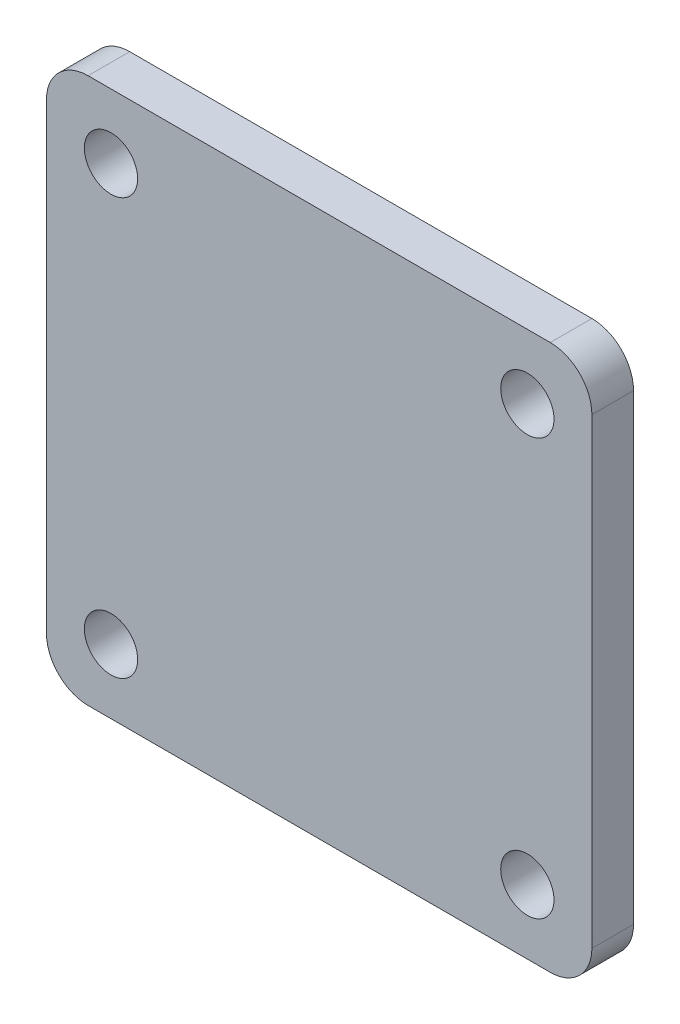
ISO-10303-21;
HEADER;
FILE_DESCRIPTION(('STEP AP214'),'2;1');
FILE_NAME('part.step','',(''),(''),'','','');
FILE_SCHEMA(('AUTOMOTIVE_DESIGN { 1 0 10303 214 1 1 1 1 }'));
ENDSEC;
DATA;
#1=APPLICATION_CONTEXT('core data for automotive mechanical design processes');
#2=APPLICATION_PROTOCOL_DEFINITION('international standard','automotive_design',2000,#1);
#3=PRODUCT_CONTEXT('',#1,'mechanical');
#4=PRODUCT('Part','Part','',(#3));
#5=PRODUCT_RELATED_PRODUCT_CATEGORY('part','',(#4));
#6=PRODUCT_DEFINITION_FORMATION('','',#4);
#7=PRODUCT_DEFINITION_CONTEXT('part definition',#1,'design');
#8=PRODUCT_DEFINITION('design','',#6,#7);
#9=PRODUCT_DEFINITION_SHAPE('','',#8);
#10=(LENGTH_UNIT() NAMED_UNIT(*) SI_UNIT(.MILLI.,.METRE.));
#11=(NAMED_UNIT(*) PLANE_ANGLE_UNIT() SI_UNIT($,.RADIAN.));
#12=(NAMED_UNIT(*) SI_UNIT($,.STERADIAN.) SOLID_ANGLE_UNIT());
#13=UNCERTAINTY_MEASURE_WITH_UNIT(LENGTH_MEASURE(1.E-05),#10,'distance_accuracy_value','');
#14=(GEOMETRIC_REPRESENTATION_CONTEXT(3) GLOBAL_UNCERTAINTY_ASSIGNED_CONTEXT((#13)) GLOBAL_UNIT_ASSIGNED_CONTEXT((#10,
#11,#12)) REPRESENTATION_CONTEXT('',''));
#15=CARTESIAN_POINT('',(0.,0.,0.));
#16=DIRECTION('',(0.,0.,1.));
#17=DIRECTION('',(1.,0.,0.));
#18=AXIS2_PLACEMENT_3D('',#15,#16,#17);
#19=CARTESIAN_POINT('',(-32.75,-32.75,5.));
#20=DIRECTION('',(-1.,0.,0.));
#21=DIRECTION('',(0.,0.,1.));
#22=AXIS2_PLACEMENT_3D('',#19,#20,#21);
#23=PLANE('',#22);
#24=DIRECTION('',(0.,1.,0.));
#25=VECTOR('',#24,1.);
#26=CARTESIAN_POINT('',(-32.75,-32.75,0.));
#27=LINE('',#26,#25);
#28=CARTESIAN_POINT('',(-32.75,-27.75,0.));
#29=VERTEX_POINT('',#28);
#30=CARTESIAN_POINT('',(-32.75,27.75,0.));
#31=VERTEX_POINT('',#30);
#32=EDGE_CURVE('E184',#29,#31,#27,.T.);
#33=ORIENTED_EDGE('',*,*,#32,.F.);
#34=DIRECTION('',(0.,0.,-1.));
#35=VECTOR('',#34,1.);
#36=CARTESIAN_POINT('',(-32.75,-27.75,5.));
#37=LINE('',#36,#35);
#38=CARTESIAN_POINT('',(-32.75,-27.75,5.));
#39=VERTEX_POINT('',#38);
#40=EDGE_CURVE('E108',#29,#39,#37,.F.);
#41=ORIENTED_EDGE('',*,*,#40,.T.);
#42=DIRECTION('',(0.,1.,0.));
#43=VECTOR('',#42,1.);
#44=CARTESIAN_POINT('',(-32.75,-32.75,5.));
#45=LINE('',#44,#43);
#46=CARTESIAN_POINT('',(-32.75,27.75,5.));
#47=VERTEX_POINT('',#46);
#48=EDGE_CURVE('E129',#39,#47,#45,.T.);
#49=ORIENTED_EDGE('',*,*,#48,.T.);
#50=DIRECTION('',(0.,0.,-1.));
#51=VECTOR('',#50,1.);
#52=CARTESIAN_POINT('',(-32.75,27.75,5.));
#53=LINE('',#52,#51);
#54=EDGE_CURVE('E113',#47,#31,#53,.T.);
#55=ORIENTED_EDGE('',*,*,#54,.T.);
#56=EDGE_LOOP('',(#33,#41,#49,#55));
#57=FACE_BOUND('',#56,.T.);
#58=ADVANCED_FACE('F35',(#57),#23,.T.);
#59=CARTESIAN_POINT('',(-32.75,-32.75,5.));
#60=DIRECTION('',(0.,1.,0.));
#61=DIRECTION('',(0.,0.,1.));
#62=AXIS2_PLACEMENT_3D('',#59,#60,#61);
#63=PLANE('',#62);
#64=DIRECTION('',(1.,0.,0.));
#65=VECTOR('',#64,1.);
#66=CARTESIAN_POINT('',(-32.75,-32.75,5.));
#67=LINE('',#66,#65);
#68=CARTESIAN_POINT('',(-27.75,-32.75,5.));
#69=VERTEX_POINT('',#68);
#70=CARTESIAN_POINT('',(27.75,-32.75,5.));
#71=VERTEX_POINT('',#70);
#72=EDGE_CURVE('E123',#69,#71,#67,.T.);
#73=ORIENTED_EDGE('',*,*,#72,.F.);
#74=DIRECTION('',(0.,0.,-1.));
#75=VECTOR('',#74,1.);
#76=CARTESIAN_POINT('',(-27.75,-32.75,0.));
#77=LINE('',#76,#75);
#78=CARTESIAN_POINT('',(-27.75,-32.75,0.));
#79=VERTEX_POINT('',#78);
#80=EDGE_CURVE('E107',#69,#79,#77,.T.);
#81=ORIENTED_EDGE('',*,*,#80,.T.);
#82=DIRECTION('',(1.,0.,0.));
#83=VECTOR('',#82,1.);
#84=CARTESIAN_POINT('',(-32.75,-32.75,0.));
#85=LINE('',#84,#83);
#86=CARTESIAN_POINT('',(27.75,-32.75,0.));
#87=VERTEX_POINT('',#86);
#88=EDGE_CURVE('E120',#79,#87,#85,.T.);
#89=ORIENTED_EDGE('',*,*,#88,.T.);
#90=DIRECTION('',(0.,0.,-1.));
#91=VECTOR('',#90,1.);
#92=CARTESIAN_POINT('',(27.75,-32.75,5.));
#93=LINE('',#92,#91);
#94=EDGE_CURVE('E125',#87,#71,#93,.F.);
#95=ORIENTED_EDGE('',*,*,#94,.T.);
#96=EDGE_LOOP('',(#73,#81,#89,#95));
#97=FACE_BOUND('',#96,.T.);
#98=ADVANCED_FACE('F119',(#97),#63,.F.);
#99=CARTESIAN_POINT('',(32.75,-32.75,5.));
#100=DIRECTION('',(-1.,0.,0.));
#101=DIRECTION('',(0.,0.,1.));
#102=AXIS2_PLACEMENT_3D('',#99,#100,#101);
#103=PLANE('',#102);
#104=DIRECTION('',(0.,1.,0.));
#105=VECTOR('',#104,1.);
#106=CARTESIAN_POINT('',(32.75,-32.75,5.));
#107=LINE('',#106,#105);
#108=CARTESIAN_POINT('',(32.75,-27.75,5.));
#109=VERTEX_POINT('',#108);
#110=CARTESIAN_POINT('',(32.75,27.75,5.));
#111=VERTEX_POINT('',#110);
#112=EDGE_CURVE('E188',#109,#111,#107,.T.);
#113=ORIENTED_EDGE('',*,*,#112,.F.);
#114=DIRECTION('',(0.,0.,-1.));
#115=VECTOR('',#114,1.);
#116=CARTESIAN_POINT('',(32.75,-27.75,5.));
#117=LINE('',#116,#115);
#118=CARTESIAN_POINT('',(32.75,-27.75,0.));
#119=VERTEX_POINT('',#118);
#120=EDGE_CURVE('E157',#109,#119,#117,.T.);
#121=ORIENTED_EDGE('',*,*,#120,.T.);
#122=DIRECTION('',(0.,1.,0.));
#123=VECTOR('',#122,1.);
#124=CARTESIAN_POINT('',(32.75,-32.75,0.));
#125=LINE('',#124,#123);
#126=CARTESIAN_POINT('',(32.75,27.75,0.));
#127=VERTEX_POINT('',#126);
#128=EDGE_CURVE('E130',#119,#127,#125,.T.);
#129=ORIENTED_EDGE('',*,*,#128,.T.);
#130=DIRECTION('',(0.,0.,-1.));
#131=VECTOR('',#130,1.);
#132=CARTESIAN_POINT('',(32.75,27.75,5.));
#133=LINE('',#132,#131);
#134=EDGE_CURVE('E155',#127,#111,#133,.F.);
#135=ORIENTED_EDGE('',*,*,#134,.T.);
#136=EDGE_LOOP('',(#113,#121,#129,#135));
#137=FACE_BOUND('',#136,.T.);
#138=ADVANCED_FACE('F205',(#137),#103,.F.);
#139=CARTESIAN_POINT('',(-32.75,32.75,5.));
#140=DIRECTION('',(0.,1.,0.));
#141=DIRECTION('',(0.,0.,1.));
#142=AXIS2_PLACEMENT_3D('',#139,#140,#141);
#143=PLANE('',#142);
#144=DIRECTION('',(1.,0.,0.));
#145=VECTOR('',#144,1.);
#146=CARTESIAN_POINT('',(-32.75,32.75,5.));
#147=LINE('',#146,#145);
#148=CARTESIAN_POINT('',(-27.75,32.75,5.));
#149=VERTEX_POINT('',#148);
#150=CARTESIAN_POINT('',(27.75,32.75,5.));
#151=VERTEX_POINT('',#150);
#152=EDGE_CURVE('E133',#149,#151,#147,.T.);
#153=ORIENTED_EDGE('',*,*,#152,.T.);
#154=DIRECTION('',(0.,0.,-1.));
#155=VECTOR('',#154,1.);
#156=CARTESIAN_POINT('',(27.75,32.75,0.));
#157=LINE('',#156,#155);
#158=CARTESIAN_POINT('',(27.75,32.75,0.));
#159=VERTEX_POINT('',#158);
#160=EDGE_CURVE('E11',#151,#159,#157,.T.);
#161=ORIENTED_EDGE('',*,*,#160,.T.);
#162=DIRECTION('',(1.,0.,0.));
#163=VECTOR('',#162,1.);
#164=CARTESIAN_POINT('',(-32.75,32.75,0.));
#165=LINE('',#164,#163);
#166=CARTESIAN_POINT('',(-27.75,32.75,0.));
#167=VERTEX_POINT('',#166);
#168=EDGE_CURVE('E136',#167,#159,#165,.T.);
#169=ORIENTED_EDGE('',*,*,#168,.F.);
#170=DIRECTION('',(0.,0.,-1.));
#171=VECTOR('',#170,1.);
#172=CARTESIAN_POINT('',(-27.75,32.75,5.));
#173=LINE('',#172,#171);
#174=EDGE_CURVE('E44',#167,#149,#173,.F.);
#175=ORIENTED_EDGE('',*,*,#174,.T.);
#176=EDGE_LOOP('',(#153,#161,#169,#175));
#177=FACE_BOUND('',#176,.T.);
#178=ADVANCED_FACE('F192',(#177),#143,.T.);
#179=CARTESIAN_POINT('',(0.,0.,5.));
#180=DIRECTION('',(0.,0.,-1.));
#181=DIRECTION('',(-1.,0.,0.));
#182=AXIS2_PLACEMENT_3D('',#179,#180,#181);
#183=PLANE('',#182);
#184=CARTESIAN_POINT('',(-25.,-25.0000000000004,5.));
#185=DIRECTION('',(0.,0.,1.));
#186=DIRECTION('',(1.,0.,0.));
#187=AXIS2_PLACEMENT_3D('',#184,#185,#186);
#188=CIRCLE('',#187,3.2);
#189=CARTESIAN_POINT('',(-21.8,-25.0000000000004,5.));
#190=VERTEX_POINT('',#189);
#191=EDGE_CURVE('E162',#190,#190,#188,.T.);
#192=ORIENTED_EDGE('',*,*,#191,.F.);
#193=EDGE_LOOP('',(#192));
#194=FACE_BOUND('',#193,.T.);
#195=CARTESIAN_POINT('',(-25.,24.9999999999997,5.));
#196=DIRECTION('',(0.,0.,1.));
#197=DIRECTION('',(1.,0.,0.));
#198=AXIS2_PLACEMENT_3D('',#195,#196,#197);
#199=CIRCLE('',#198,3.2);
#200=CARTESIAN_POINT('',(-21.8,24.9999999999997,5.));
#201=VERTEX_POINT('',#200);
#202=EDGE_CURVE('E168',#201,#201,#199,.T.);
#203=ORIENTED_EDGE('',*,*,#202,.F.);
#204=EDGE_LOOP('',(#203));
#205=FACE_BOUND('',#204,.T.);
#206=CARTESIAN_POINT('',(25.,25.,5.));
#207=DIRECTION('',(0.,0.,-1.));
#208=DIRECTION('',(-1.,0.,0.));
#209=AXIS2_PLACEMENT_3D('',#206,#207,#208);
#210=CIRCLE('',#209,3.2);
#211=CARTESIAN_POINT('',(21.8,25.,5.));
#212=VERTEX_POINT('',#211);
#213=EDGE_CURVE('E175',#212,#212,#210,.T.);
#214=ORIENTED_EDGE('',*,*,#213,.T.);
#215=EDGE_LOOP('',(#214));
#216=FACE_BOUND('',#215,.T.);
#217=CARTESIAN_POINT('',(25.,-25.,5.));
#218=DIRECTION('',(0.,0.,-1.));
#219=DIRECTION('',(-1.,0.,0.));
#220=AXIS2_PLACEMENT_3D('',#217,#218,#219);
#221=CIRCLE('',#220,3.2);
#222=CARTESIAN_POINT('',(21.8,-25.,5.));
#223=VERTEX_POINT('',#222);
#224=EDGE_CURVE('E181',#223,#223,#221,.T.);
#225=ORIENTED_EDGE('',*,*,#224,.T.);
#226=EDGE_LOOP('',(#225));
#227=FACE_BOUND('',#226,.T.);
#228=ORIENTED_EDGE('',*,*,#48,.F.);
#229=CARTESIAN_POINT('',(-27.75,-27.75,5.));
#230=DIRECTION('',(0.,0.,-1.));
#231=DIRECTION('',(-1.,0.,0.));
#232=AXIS2_PLACEMENT_3D('',#229,#230,#231);
#233=CIRCLE('',#232,5.);
#234=EDGE_CURVE('E153',#39,#69,#233,.F.);
#235=ORIENTED_EDGE('',*,*,#234,.T.);
#236=ORIENTED_EDGE('',*,*,#72,.T.);
#237=CARTESIAN_POINT('',(27.75,-27.75,5.));
#238=DIRECTION('',(0.,0.,-1.));
#239=DIRECTION('',(-1.,0.,0.));
#240=AXIS2_PLACEMENT_3D('',#237,#238,#239);
#241=CIRCLE('',#240,5.);
#242=EDGE_CURVE('E151',#71,#109,#241,.F.);
#243=ORIENTED_EDGE('',*,*,#242,.T.);
#244=ORIENTED_EDGE('',*,*,#112,.T.);
#245=CARTESIAN_POINT('',(27.75,27.75,5.));
#246=DIRECTION('',(0.,0.,-1.));
#247=DIRECTION('',(-1.,0.,0.));
#248=AXIS2_PLACEMENT_3D('',#245,#246,#247);
#249=CIRCLE('',#248,5.);
#250=EDGE_CURVE('E52',#111,#151,#249,.F.);
#251=ORIENTED_EDGE('',*,*,#250,.T.);
#252=ORIENTED_EDGE('',*,*,#152,.F.);
#253=CARTESIAN_POINT('',(-27.75,27.75,5.));
#254=DIRECTION('',(0.,0.,-1.));
#255=DIRECTION('',(-1.,0.,0.));
#256=AXIS2_PLACEMENT_3D('',#253,#254,#255);
#257=CIRCLE('',#256,5.);
#258=EDGE_CURVE('E148',#149,#47,#257,.F.);
#259=ORIENTED_EDGE('',*,*,#258,.T.);
#260=EDGE_LOOP('',(#228,#235,#236,#243,#244,#251,#252,#259));
#261=FACE_BOUND('',#260,.T.);
#262=ADVANCED_FACE('F198',(#194,#205,#216,#227,#261),#183,.F.);
#263=CARTESIAN_POINT('',(0.,0.,0.));
#264=DIRECTION('',(0.,0.,-1.));
#265=DIRECTION('',(-1.,0.,0.));
#266=AXIS2_PLACEMENT_3D('',#263,#264,#265);
#267=PLANE('',#266);
#268=CARTESIAN_POINT('',(-25.,-25.0000000000004,0.));
#269=DIRECTION('',(0.,0.,-1.));
#270=DIRECTION('',(-1.,0.,0.));
#271=AXIS2_PLACEMENT_3D('',#268,#269,#270);
#272=CIRCLE('',#271,3.2);
#273=CARTESIAN_POINT('',(-28.2,-25.0000000000004,0.));
#274=VERTEX_POINT('',#273);
#275=EDGE_CURVE('E39',#274,#274,#272,.T.);
#276=ORIENTED_EDGE('',*,*,#275,.F.);
#277=EDGE_LOOP('',(#276));
#278=FACE_BOUND('',#277,.T.);
#279=CARTESIAN_POINT('',(-25.,24.9999999999997,0.));
#280=DIRECTION('',(0.,0.,-1.));
#281=DIRECTION('',(-1.,0.,0.));
#282=AXIS2_PLACEMENT_3D('',#279,#280,#281);
#283=CIRCLE('',#282,3.2);
#284=CARTESIAN_POINT('',(-28.2,24.9999999999997,0.));
#285=VERTEX_POINT('',#284);
#286=EDGE_CURVE('E160',#285,#285,#283,.T.);
#287=ORIENTED_EDGE('',*,*,#286,.F.);
#288=EDGE_LOOP('',(#287));
#289=FACE_BOUND('',#288,.T.);
#290=CARTESIAN_POINT('',(25.,25.,0.));
#291=DIRECTION('',(0.,0.,-1.));
#292=DIRECTION('',(-1.,0.,0.));
#293=AXIS2_PLACEMENT_3D('',#290,#291,#292);
#294=CIRCLE('',#293,3.2);
#295=CARTESIAN_POINT('',(21.8,25.,0.));
#296=VERTEX_POINT('',#295);
#297=EDGE_CURVE('E166',#296,#296,#294,.T.);
#298=ORIENTED_EDGE('',*,*,#297,.F.);
#299=EDGE_LOOP('',(#298));
#300=FACE_BOUND('',#299,.T.);
#301=CARTESIAN_POINT('',(25.,-25.,0.));
#302=DIRECTION('',(0.,0.,-1.));
#303=DIRECTION('',(-1.,0.,0.));
#304=AXIS2_PLACEMENT_3D('',#301,#302,#303);
#305=CIRCLE('',#304,3.2);
#306=CARTESIAN_POINT('',(21.8,-25.,0.));
#307=VERTEX_POINT('',#306);
#308=EDGE_CURVE('E178',#307,#307,#305,.T.);
#309=ORIENTED_EDGE('',*,*,#308,.F.);
#310=EDGE_LOOP('',(#309));
#311=FACE_BOUND('',#310,.T.);
#312=ORIENTED_EDGE('',*,*,#88,.F.);
#313=CARTESIAN_POINT('',(-27.75,-27.75,0.));
#314=DIRECTION('',(0.,0.,-1.));
#315=DIRECTION('',(-1.,0.,0.));
#316=AXIS2_PLACEMENT_3D('',#313,#314,#315);
#317=CIRCLE('',#316,5.);
#318=EDGE_CURVE('E103',#79,#29,#317,.T.);
#319=ORIENTED_EDGE('',*,*,#318,.T.);
#320=ORIENTED_EDGE('',*,*,#32,.T.);
#321=CARTESIAN_POINT('',(-27.75,27.75,0.));
#322=DIRECTION('',(0.,0.,-1.));
#323=DIRECTION('',(-1.,0.,0.));
#324=AXIS2_PLACEMENT_3D('',#321,#322,#323);
#325=CIRCLE('',#324,5.);
#326=EDGE_CURVE('E124',#31,#167,#325,.T.);
#327=ORIENTED_EDGE('',*,*,#326,.T.);
#328=ORIENTED_EDGE('',*,*,#168,.T.);
#329=CARTESIAN_POINT('',(27.75,27.75,0.));
#330=DIRECTION('',(0.,0.,-1.));
#331=DIRECTION('',(-1.,0.,0.));
#332=AXIS2_PLACEMENT_3D('',#329,#330,#331);
#333=CIRCLE('',#332,5.);
#334=EDGE_CURVE('E142',#159,#127,#333,.T.);
#335=ORIENTED_EDGE('',*,*,#334,.T.);
#336=ORIENTED_EDGE('',*,*,#128,.F.);
#337=CARTESIAN_POINT('',(27.75,-27.75,0.));
#338=DIRECTION('',(0.,0.,-1.));
#339=DIRECTION('',(-1.,0.,0.));
#340=AXIS2_PLACEMENT_3D('',#337,#338,#339);
#341=CIRCLE('',#340,5.);
#342=EDGE_CURVE('E114',#119,#87,#341,.T.);
#343=ORIENTED_EDGE('',*,*,#342,.T.);
#344=EDGE_LOOP('',(#312,#319,#320,#327,#328,#335,#336,#343));
#345=FACE_BOUND('',#344,.T.);
#346=ADVANCED_FACE('F127',(#278,#289,#300,#311,#345),#267,.T.);
#347=CARTESIAN_POINT('',(-27.75,-27.75,5.));
#348=DIRECTION('',(0.,0.,1.));
#349=DIRECTION('',(1.,0.,0.));
#350=AXIS2_PLACEMENT_3D('',#347,#348,#349);
#351=CYLINDRICAL_SURFACE('',#350,5.);
#352=ORIENTED_EDGE('',*,*,#234,.F.);
#353=ORIENTED_EDGE('',*,*,#40,.F.);
#354=ORIENTED_EDGE('',*,*,#318,.F.);
#355=ORIENTED_EDGE('',*,*,#80,.F.);
#356=EDGE_LOOP('',(#352,#353,#354,#355));
#357=FACE_BOUND('',#356,.T.);
#358=ADVANCED_FACE('F106',(#357),#351,.T.);
#359=CARTESIAN_POINT('',(27.75,-27.75,5.));
#360=DIRECTION('',(0.,0.,-1.));
#361=DIRECTION('',(-1.,0.,0.));
#362=AXIS2_PLACEMENT_3D('',#359,#360,#361);
#363=CYLINDRICAL_SURFACE('',#362,5.);
#364=ORIENTED_EDGE('',*,*,#242,.F.);
#365=ORIENTED_EDGE('',*,*,#94,.F.);
#366=ORIENTED_EDGE('',*,*,#342,.F.);
#367=ORIENTED_EDGE('',*,*,#120,.F.);
#368=EDGE_LOOP('',(#364,#365,#366,#367));
#369=FACE_BOUND('',#368,.T.);
#370=ADVANCED_FACE('F212',(#369),#363,.T.);
#371=CARTESIAN_POINT('',(27.75,27.75,5.));
#372=DIRECTION('',(0.,0.,1.));
#373=DIRECTION('',(1.,0.,0.));
#374=AXIS2_PLACEMENT_3D('',#371,#372,#373);
#375=CYLINDRICAL_SURFACE('',#374,5.);
#376=ORIENTED_EDGE('',*,*,#250,.F.);
#377=ORIENTED_EDGE('',*,*,#134,.F.);
#378=ORIENTED_EDGE('',*,*,#334,.F.);
#379=ORIENTED_EDGE('',*,*,#160,.F.);
#380=EDGE_LOOP('',(#376,#377,#378,#379));
#381=FACE_BOUND('',#380,.T.);
#382=ADVANCED_FACE('F214',(#381),#375,.T.);
#383=CARTESIAN_POINT('',(-27.75,27.75,5.));
#384=DIRECTION('',(0.,0.,-1.));
#385=DIRECTION('',(-1.,0.,0.));
#386=AXIS2_PLACEMENT_3D('',#383,#384,#385);
#387=CYLINDRICAL_SURFACE('',#386,5.);
#388=ORIENTED_EDGE('',*,*,#258,.F.);
#389=ORIENTED_EDGE('',*,*,#174,.F.);
#390=ORIENTED_EDGE('',*,*,#326,.F.);
#391=ORIENTED_EDGE('',*,*,#54,.F.);
#392=EDGE_LOOP('',(#388,#389,#390,#391));
#393=FACE_BOUND('',#392,.T.);
#394=ADVANCED_FACE('F37',(#393),#387,.T.);
#395=CARTESIAN_POINT('',(25.,-25.,5.));
#396=DIRECTION('',(0.,0.,-1.));
#397=DIRECTION('',(-1.,0.,0.));
#398=AXIS2_PLACEMENT_3D('',#395,#396,#397);
#399=CYLINDRICAL_SURFACE('',#398,3.2);
#400=ORIENTED_EDGE('',*,*,#224,.F.);
#401=EDGE_LOOP('',(#400));
#402=FACE_BOUND('',#401,.T.);
#403=ORIENTED_EDGE('',*,*,#308,.T.);
#404=EDGE_LOOP('',(#403));
#405=FACE_BOUND('',#404,.T.);
#406=ADVANCED_FACE('F221',(#402,#405),#399,.F.);
#407=CARTESIAN_POINT('',(25.,25.,5.));
#408=DIRECTION('',(0.,0.,-1.));
#409=DIRECTION('',(-1.,0.,0.));
#410=AXIS2_PLACEMENT_3D('',#407,#408,#409);
#411=CYLINDRICAL_SURFACE('',#410,3.2);
#412=ORIENTED_EDGE('',*,*,#213,.F.);
#413=EDGE_LOOP('',(#412));
#414=FACE_BOUND('',#413,.T.);
#415=ORIENTED_EDGE('',*,*,#297,.T.);
#416=EDGE_LOOP('',(#415));
#417=FACE_BOUND('',#416,.T.);
#418=ADVANCED_FACE('F240',(#414,#417),#411,.F.);
#419=CARTESIAN_POINT('',(-25.,24.9999999999997,-10.));
#420=DIRECTION('',(0.,0.,1.));
#421=DIRECTION('',(1.,0.,0.));
#422=AXIS2_PLACEMENT_3D('',#419,#420,#421);
#423=CYLINDRICAL_SURFACE('',#422,3.2);
#424=ORIENTED_EDGE('',*,*,#286,.T.);
#425=EDGE_LOOP('',(#424));
#426=FACE_BOUND('',#425,.T.);
#427=ORIENTED_EDGE('',*,*,#202,.T.);
#428=EDGE_LOOP('',(#427));
#429=FACE_BOUND('',#428,.T.);
#430=ADVANCED_FACE('F244',(#426,#429),#423,.F.);
#431=CARTESIAN_POINT('',(-25.,-25.0000000000004,-10.));
#432=DIRECTION('',(0.,0.,1.));
#433=DIRECTION('',(1.,0.,0.));
#434=AXIS2_PLACEMENT_3D('',#431,#432,#433);
#435=CYLINDRICAL_SURFACE('',#434,3.2);
#436=ORIENTED_EDGE('',*,*,#275,.T.);
#437=EDGE_LOOP('',(#436));
#438=FACE_BOUND('',#437,.T.);
#439=ORIENTED_EDGE('',*,*,#191,.T.);
#440=EDGE_LOOP('',(#439));
#441=FACE_BOUND('',#440,.T.);
#442=ADVANCED_FACE('F246',(#438,#441),#435,.F.);
#443=CLOSED_SHELL('',(#58,#98,#138,#178,#262,#346,#358,#370,#382,#394,#406,#418,#430,#442));
#444=MANIFOLD_SOLID_BREP('B2',#443);
#445=ADVANCED_BREP_SHAPE_REPRESENTATION('',(#18,#444),#14);
#446=SHAPE_DEFINITION_REPRESENTATION(#9,#445);
ENDSEC;
END-ISO-10303-21;
